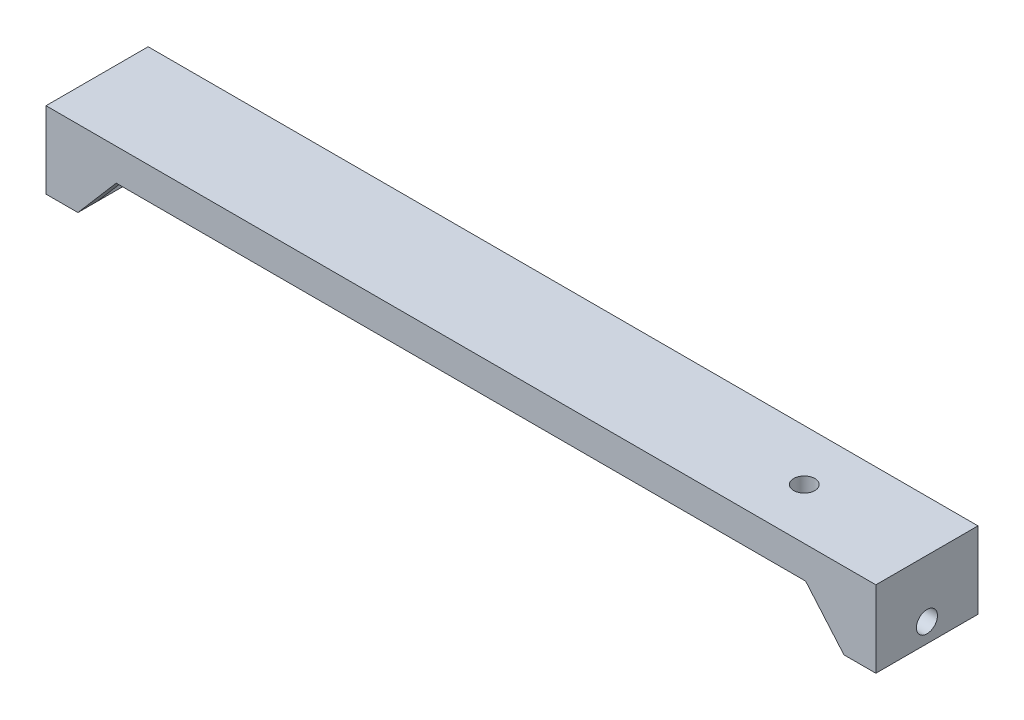
ISO-10303-21;
HEADER;
FILE_DESCRIPTION(('STEP AP214'),'2;1');
FILE_NAME('part.step','',(''),(''),'','','');
FILE_SCHEMA(('AUTOMOTIVE_DESIGN { 1 0 10303 214 1 1 1 1 }'));
ENDSEC;
DATA;
#1=APPLICATION_CONTEXT('core data for automotive mechanical design processes');
#2=APPLICATION_PROTOCOL_DEFINITION('international standard','automotive_design',2000,#1);
#3=PRODUCT_CONTEXT('',#1,'mechanical');
#4=PRODUCT('Part','Part','',(#3));
#5=PRODUCT_RELATED_PRODUCT_CATEGORY('part','',(#4));
#6=PRODUCT_DEFINITION_FORMATION('','',#4);
#7=PRODUCT_DEFINITION_CONTEXT('part definition',#1,'design');
#8=PRODUCT_DEFINITION('design','',#6,#7);
#9=PRODUCT_DEFINITION_SHAPE('','',#8);
#10=(LENGTH_UNIT() NAMED_UNIT(*) SI_UNIT(.MILLI.,.METRE.));
#11=(NAMED_UNIT(*) PLANE_ANGLE_UNIT() SI_UNIT($,.RADIAN.));
#12=(NAMED_UNIT(*) SI_UNIT($,.STERADIAN.) SOLID_ANGLE_UNIT());
#13=UNCERTAINTY_MEASURE_WITH_UNIT(LENGTH_MEASURE(1.E-05),#10,'distance_accuracy_value','');
#14=(GEOMETRIC_REPRESENTATION_CONTEXT(3) GLOBAL_UNCERTAINTY_ASSIGNED_CONTEXT((#13)) GLOBAL_UNIT_ASSIGNED_CONTEXT((#10,
#11,#12)) REPRESENTATION_CONTEXT('',''));
#15=CARTESIAN_POINT('',(0.,0.,0.));
#16=DIRECTION('',(0.,0.,1.));
#17=DIRECTION('',(1.,0.,0.));
#18=AXIS2_PLACEMENT_3D('',#15,#16,#17);
#19=CARTESIAN_POINT('',(60.,-5.00000000000001,16.));
#20=DIRECTION('',(0.,1.,0.));
#21=DIRECTION('',(0.,0.,1.));
#22=AXIS2_PLACEMENT_3D('',#19,#20,#21);
#23=PLANE('',#22);
#24=CARTESIAN_POINT('',(45.79,-5.00000000000001,8.));
#25=DIRECTION('',(0.,1.,0.));
#26=DIRECTION('',(0.,0.,1.));
#27=AXIS2_PLACEMENT_3D('',#24,#25,#26);
#28=CIRCLE('',#27,1.65);
#29=CARTESIAN_POINT('',(45.79,-5.00000000000001,9.65));
#30=VERTEX_POINT('',#29);
#31=EDGE_CURVE('E155',#30,#30,#28,.T.);
#32=ORIENTED_EDGE('',*,*,#31,.T.);
#33=EDGE_LOOP('',(#32));
#34=FACE_BOUND('',#33,.T.);
#35=DIRECTION('',(-1.,0.,0.));
#36=VECTOR('',#35,1.);
#37=CARTESIAN_POINT('',(54.,-5.00000000000001,13.));
#38=LINE('',#37,#36);
#39=CARTESIAN_POINT('',(60.,-5.00000000000001,13.));
#40=VERTEX_POINT('',#39);
#41=CARTESIAN_POINT('',(54.,-5.00000000000001,13.));
#42=VERTEX_POINT('',#41);
#43=EDGE_CURVE('E151',#40,#42,#38,.T.);
#44=ORIENTED_EDGE('',*,*,#43,.T.);
#45=DIRECTION('',(0.,0.,1.));
#46=VECTOR('',#45,1.);
#47=CARTESIAN_POINT('',(54.,-5.00000000000001,13.));
#48=LINE('',#47,#46);
#49=CARTESIAN_POINT('',(54.,-5.00000000000001,16.));
#50=VERTEX_POINT('',#49);
#51=EDGE_CURVE('E136',#42,#50,#48,.T.);
#52=ORIENTED_EDGE('',*,*,#51,.T.);
#53=DIRECTION('',(1.,0.,0.));
#54=VECTOR('',#53,1.);
#55=CARTESIAN_POINT('',(60.,-5.00000000000001,16.));
#56=LINE('',#55,#54);
#57=CARTESIAN_POINT('',(-54.,-5.00000000000001,16.));
#58=VERTEX_POINT('',#57);
#59=EDGE_CURVE('E224',#58,#50,#56,.T.);
#60=ORIENTED_EDGE('',*,*,#59,.F.);
#61=DIRECTION('',(0.,0.,1.));
#62=VECTOR('',#61,1.);
#63=CARTESIAN_POINT('',(-54.,-5.00000000000001,13.));
#64=LINE('',#63,#62);
#65=CARTESIAN_POINT('',(-54.,-5.00000000000001,13.));
#66=VERTEX_POINT('',#65);
#67=EDGE_CURVE('E184',#66,#58,#64,.T.);
#68=ORIENTED_EDGE('',*,*,#67,.F.);
#69=DIRECTION('',(1.,0.,0.));
#70=VECTOR('',#69,1.);
#71=CARTESIAN_POINT('',(-54.,-5.00000000000001,13.));
#72=LINE('',#71,#70);
#73=CARTESIAN_POINT('',(-60.,-5.00000000000001,13.));
#74=VERTEX_POINT('',#73);
#75=EDGE_CURVE('E177',#74,#66,#72,.T.);
#76=ORIENTED_EDGE('',*,*,#75,.F.);
#77=DIRECTION('',(0.,0.,-1.));
#78=VECTOR('',#77,1.);
#79=CARTESIAN_POINT('',(-60.,-5.00000000000001,16.));
#80=LINE('',#79,#78);
#81=CARTESIAN_POINT('',(-60.,-5.00000000000001,3.));
#82=VERTEX_POINT('',#81);
#83=EDGE_CURVE('E257',#74,#82,#80,.T.);
#84=ORIENTED_EDGE('',*,*,#83,.T.);
#85=DIRECTION('',(1.,0.,0.));
#86=VECTOR('',#85,1.);
#87=CARTESIAN_POINT('',(-54.,-5.00000000000001,3.));
#88=LINE('',#87,#86);
#89=CARTESIAN_POINT('',(-54.,-5.00000000000001,3.));
#90=VERTEX_POINT('',#89);
#91=EDGE_CURVE('E189',#82,#90,#88,.T.);
#92=ORIENTED_EDGE('',*,*,#91,.T.);
#93=DIRECTION('',(0.,0.,-1.));
#94=VECTOR('',#93,1.);
#95=CARTESIAN_POINT('',(-54.,-5.00000000000001,3.));
#96=LINE('',#95,#94);
#97=CARTESIAN_POINT('',(-54.,-5.,0.));
#98=VERTEX_POINT('',#97);
#99=EDGE_CURVE('E197',#90,#98,#96,.T.);
#100=ORIENTED_EDGE('',*,*,#99,.T.);
#101=DIRECTION('',(1.,0.,0.));
#102=VECTOR('',#101,1.);
#103=CARTESIAN_POINT('',(60.,-5.00000000000001,0.));
#104=LINE('',#103,#102);
#105=CARTESIAN_POINT('',(54.,-5.00000000000002,0.));
#106=VERTEX_POINT('',#105);
#107=EDGE_CURVE('E237',#98,#106,#104,.T.);
#108=ORIENTED_EDGE('',*,*,#107,.T.);
#109=DIRECTION('',(0.,0.,-1.));
#110=VECTOR('',#109,1.);
#111=CARTESIAN_POINT('',(54.,-5.00000000000001,3.));
#112=LINE('',#111,#110);
#113=CARTESIAN_POINT('',(54.,-5.00000000000001,3.));
#114=VERTEX_POINT('',#113);
#115=EDGE_CURVE('E49',#114,#106,#112,.T.);
#116=ORIENTED_EDGE('',*,*,#115,.F.);
#117=DIRECTION('',(-1.,0.,0.));
#118=VECTOR('',#117,1.);
#119=CARTESIAN_POINT('',(54.,-5.00000000000001,3.));
#120=LINE('',#119,#118);
#121=CARTESIAN_POINT('',(60.,-5.00000000000001,3.));
#122=VERTEX_POINT('',#121);
#123=EDGE_CURVE('E161',#122,#114,#120,.T.);
#124=ORIENTED_EDGE('',*,*,#123,.F.);
#125=DIRECTION('',(0.,0.,-1.));
#126=VECTOR('',#125,1.);
#127=CARTESIAN_POINT('',(60.,-5.00000000000001,16.));
#128=LINE('',#127,#126);
#129=EDGE_CURVE('E57',#40,#122,#128,.T.);
#130=ORIENTED_EDGE('',*,*,#129,.F.);
#131=EDGE_LOOP('',(#44,#52,#60,#68,#76,#84,#92,#100,#108,#116,#124,#130));
#132=FACE_BOUND('',#131,.T.);
#133=ADVANCED_FACE('F34',(#34,#132),#23,.F.);
#134=CARTESIAN_POINT('',(-65.,-12.,16.));
#135=DIRECTION('',(1.,0.,0.));
#136=DIRECTION('',(0.,0.,-1.));
#137=AXIS2_PLACEMENT_3D('',#134,#135,#136);
#138=PLANE('',#137);
#139=CARTESIAN_POINT('',(-65.,-8.99999999999993,8.));
#140=DIRECTION('',(1.,0.,0.));
#141=DIRECTION('',(0.,1.,0.));
#142=AXIS2_PLACEMENT_3D('',#139,#140,#141);
#143=CIRCLE('',#142,1.65);
#144=CARTESIAN_POINT('',(-65.,-7.34999999999993,8.));
#145=VERTEX_POINT('',#144);
#146=EDGE_CURVE('E207',#145,#145,#143,.T.);
#147=ORIENTED_EDGE('',*,*,#146,.T.);
#148=EDGE_LOOP('',(#147));
#149=FACE_BOUND('',#148,.T.);
#150=DIRECTION('',(0.,-1.,0.));
#151=VECTOR('',#150,1.);
#152=CARTESIAN_POINT('',(-65.,-12.,0.));
#153=LINE('',#152,#151);
#154=CARTESIAN_POINT('',(-65.,0.,0.));
#155=VERTEX_POINT('',#154);
#156=CARTESIAN_POINT('',(-65.,-12.,0.));
#157=VERTEX_POINT('',#156);
#158=EDGE_CURVE('E216',#155,#157,#153,.T.);
#159=ORIENTED_EDGE('',*,*,#158,.T.);
#160=DIRECTION('',(0.,0.,-1.));
#161=VECTOR('',#160,1.);
#162=CARTESIAN_POINT('',(-65.,-12.,16.));
#163=LINE('',#162,#161);
#164=CARTESIAN_POINT('',(-65.,-12.,16.));
#165=VERTEX_POINT('',#164);
#166=EDGE_CURVE('E11',#165,#157,#163,.T.);
#167=ORIENTED_EDGE('',*,*,#166,.F.);
#168=DIRECTION('',(0.,-1.,0.));
#169=VECTOR('',#168,1.);
#170=CARTESIAN_POINT('',(-65.,-12.,16.));
#171=LINE('',#170,#169);
#172=CARTESIAN_POINT('',(-65.,0.,16.));
#173=VERTEX_POINT('',#172);
#174=EDGE_CURVE('E217',#173,#165,#171,.T.);
#175=ORIENTED_EDGE('',*,*,#174,.F.);
#176=DIRECTION('',(0.,0.,-1.));
#177=VECTOR('',#176,1.);
#178=CARTESIAN_POINT('',(-65.,0.,16.));
#179=LINE('',#178,#177);
#180=EDGE_CURVE('E232',#173,#155,#179,.T.);
#181=ORIENTED_EDGE('',*,*,#180,.T.);
#182=EDGE_LOOP('',(#159,#167,#175,#181));
#183=FACE_BOUND('',#182,.T.);
#184=ADVANCED_FACE('F36',(#149,#183),#138,.F.);
#185=CARTESIAN_POINT('',(-60.,-12.,16.));
#186=DIRECTION('',(0.,1.,0.));
#187=DIRECTION('',(-1.,0.,0.));
#188=AXIS2_PLACEMENT_3D('',#185,#186,#187);
#189=PLANE('',#188);
#190=DIRECTION('',(1.,0.,0.));
#191=VECTOR('',#190,1.);
#192=CARTESIAN_POINT('',(-60.,-12.,0.));
#193=LINE('',#192,#191);
#194=CARTESIAN_POINT('',(-60.,-12.,0.));
#195=VERTEX_POINT('',#194);
#196=EDGE_CURVE('E235',#157,#195,#193,.T.);
#197=ORIENTED_EDGE('',*,*,#196,.T.);
#198=DIRECTION('',(0.,0.,-1.));
#199=VECTOR('',#198,1.);
#200=CARTESIAN_POINT('',(-60.,-12.,3.));
#201=LINE('',#200,#199);
#202=CARTESIAN_POINT('',(-60.,-12.,3.));
#203=VERTEX_POINT('',#202);
#204=EDGE_CURVE('E200',#203,#195,#201,.T.);
#205=ORIENTED_EDGE('',*,*,#204,.F.);
#206=DIRECTION('',(0.,0.,-1.));
#207=VECTOR('',#206,1.);
#208=CARTESIAN_POINT('',(-60.,-12.,16.));
#209=LINE('',#208,#207);
#210=CARTESIAN_POINT('',(-60.,-12.,13.));
#211=VERTEX_POINT('',#210);
#212=EDGE_CURVE('E258',#211,#203,#209,.T.);
#213=ORIENTED_EDGE('',*,*,#212,.F.);
#214=CARTESIAN_POINT('',(-60.,-12.,16.));
#215=VERTEX_POINT('',#214);
#216=EDGE_CURVE('E42',#215,#211,#209,.T.);
#217=ORIENTED_EDGE('',*,*,#216,.F.);
#218=DIRECTION('',(1.,0.,0.));
#219=VECTOR('',#218,1.);
#220=CARTESIAN_POINT('',(-60.,-12.,16.));
#221=LINE('',#220,#219);
#222=EDGE_CURVE('E220',#165,#215,#221,.T.);
#223=ORIENTED_EDGE('',*,*,#222,.F.);
#224=ORIENTED_EDGE('',*,*,#166,.T.);
#225=EDGE_LOOP('',(#197,#205,#213,#217,#223,#224));
#226=FACE_BOUND('',#225,.T.);
#227=ADVANCED_FACE('F271',(#226),#189,.F.);
#228=CARTESIAN_POINT('',(-60.,-5.00000000000001,16.));
#229=DIRECTION('',(-1.,0.,0.));
#230=DIRECTION('',(0.,-1.,0.));
#231=AXIS2_PLACEMENT_3D('',#228,#229,#230);
#232=PLANE('',#231);
#233=CARTESIAN_POINT('',(-60.,-8.99999999999994,8.));
#234=DIRECTION('',(-1.,0.,0.));
#235=DIRECTION('',(0.,-1.,0.));
#236=AXIS2_PLACEMENT_3D('',#233,#234,#235);
#237=CIRCLE('',#236,1.65);
#238=CARTESIAN_POINT('',(-60.,-10.6499999999999,8.));
#239=VERTEX_POINT('',#238);
#240=EDGE_CURVE('E213',#239,#239,#237,.T.);
#241=ORIENTED_EDGE('',*,*,#240,.T.);
#242=EDGE_LOOP('',(#241));
#243=FACE_BOUND('',#242,.T.);
#244=ORIENTED_EDGE('',*,*,#83,.F.);
#245=DIRECTION('',(0.,1.,0.));
#246=VECTOR('',#245,1.);
#247=CARTESIAN_POINT('',(-60.,-5.00000000000001,13.));
#248=LINE('',#247,#246);
#249=EDGE_CURVE('E180',#211,#74,#248,.T.);
#250=ORIENTED_EDGE('',*,*,#249,.F.);
#251=ORIENTED_EDGE('',*,*,#212,.T.);
#252=DIRECTION('',(0.,1.,0.));
#253=VECTOR('',#252,1.);
#254=CARTESIAN_POINT('',(-60.,-5.00000000000001,3.));
#255=LINE('',#254,#253);
#256=EDGE_CURVE('E194',#203,#82,#255,.T.);
#257=ORIENTED_EDGE('',*,*,#256,.T.);
#258=EDGE_LOOP('',(#244,#250,#251,#257));
#259=FACE_BOUND('',#258,.T.);
#260=ADVANCED_FACE('F267',(#243,#259),#232,.F.);
#261=CARTESIAN_POINT('',(60.,-12.,16.));
#262=DIRECTION('',(1.,0.,0.));
#263=DIRECTION('',(0.,1.,0.));
#264=AXIS2_PLACEMENT_3D('',#261,#262,#263);
#265=PLANE('',#264);
#266=CARTESIAN_POINT('',(60.,-9.00000000000001,8.));
#267=DIRECTION('',(1.,0.,0.));
#268=DIRECTION('',(0.,1.,0.));
#269=AXIS2_PLACEMENT_3D('',#266,#267,#268);
#270=CIRCLE('',#269,1.65);
#271=CARTESIAN_POINT('',(60.,-7.35000000000001,8.));
#272=VERTEX_POINT('',#271);
#273=EDGE_CURVE('E210',#272,#272,#270,.T.);
#274=ORIENTED_EDGE('',*,*,#273,.T.);
#275=EDGE_LOOP('',(#274));
#276=FACE_BOUND('',#275,.T.);
#277=DIRECTION('',(0.,0.,-1.));
#278=VECTOR('',#277,1.);
#279=CARTESIAN_POINT('',(60.,-12.,16.));
#280=LINE('',#279,#278);
#281=CARTESIAN_POINT('',(60.,-12.,13.));
#282=VERTEX_POINT('',#281);
#283=CARTESIAN_POINT('',(60.,-12.,3.));
#284=VERTEX_POINT('',#283);
#285=EDGE_CURVE('E252',#282,#284,#280,.T.);
#286=ORIENTED_EDGE('',*,*,#285,.F.);
#287=DIRECTION('',(0.,1.,0.));
#288=VECTOR('',#287,1.);
#289=CARTESIAN_POINT('',(60.,-5.00000000000001,13.));
#290=LINE('',#289,#288);
#291=EDGE_CURVE('E147',#282,#40,#290,.T.);
#292=ORIENTED_EDGE('',*,*,#291,.T.);
#293=ORIENTED_EDGE('',*,*,#129,.T.);
#294=DIRECTION('',(0.,1.,0.));
#295=VECTOR('',#294,1.);
#296=CARTESIAN_POINT('',(60.,-5.00000000000001,3.));
#297=LINE('',#296,#295);
#298=EDGE_CURVE('E164',#284,#122,#297,.T.);
#299=ORIENTED_EDGE('',*,*,#298,.F.);
#300=EDGE_LOOP('',(#286,#292,#293,#299));
#301=FACE_BOUND('',#300,.T.);
#302=ADVANCED_FACE('F302',(#276,#301),#265,.F.);
#303=CARTESIAN_POINT('',(65.,-12.,16.));
#304=DIRECTION('',(0.,1.,0.));
#305=DIRECTION('',(-1.,0.,0.));
#306=AXIS2_PLACEMENT_3D('',#303,#304,#305);
#307=PLANE('',#306);
#308=DIRECTION('',(1.,0.,0.));
#309=VECTOR('',#308,1.);
#310=CARTESIAN_POINT('',(65.,-12.,0.));
#311=LINE('',#310,#309);
#312=CARTESIAN_POINT('',(60.,-12.,0.));
#313=VERTEX_POINT('',#312);
#314=CARTESIAN_POINT('',(65.,-12.,0.));
#315=VERTEX_POINT('',#314);
#316=EDGE_CURVE('E239',#313,#315,#311,.T.);
#317=ORIENTED_EDGE('',*,*,#316,.T.);
#318=DIRECTION('',(0.,0.,-1.));
#319=VECTOR('',#318,1.);
#320=CARTESIAN_POINT('',(65.,-12.,16.));
#321=LINE('',#320,#319);
#322=CARTESIAN_POINT('',(65.,-12.,16.));
#323=VERTEX_POINT('',#322);
#324=EDGE_CURVE('E249',#323,#315,#321,.T.);
#325=ORIENTED_EDGE('',*,*,#324,.F.);
#326=DIRECTION('',(1.,0.,0.));
#327=VECTOR('',#326,1.);
#328=CARTESIAN_POINT('',(65.,-12.,16.));
#329=LINE('',#328,#327);
#330=CARTESIAN_POINT('',(60.,-12.,16.));
#331=VERTEX_POINT('',#330);
#332=EDGE_CURVE('E226',#331,#323,#329,.T.);
#333=ORIENTED_EDGE('',*,*,#332,.F.);
#334=EDGE_CURVE('E253',#331,#282,#280,.T.);
#335=ORIENTED_EDGE('',*,*,#334,.T.);
#336=ORIENTED_EDGE('',*,*,#285,.T.);
#337=DIRECTION('',(0.,0.,-1.));
#338=VECTOR('',#337,1.);
#339=CARTESIAN_POINT('',(60.,-12.,3.));
#340=LINE('',#339,#338);
#341=EDGE_CURVE('E170',#284,#313,#340,.T.);
#342=ORIENTED_EDGE('',*,*,#341,.T.);
#343=EDGE_LOOP('',(#317,#325,#333,#335,#336,#342));
#344=FACE_BOUND('',#343,.T.);
#345=ADVANCED_FACE('F305',(#344),#307,.F.);
#346=CARTESIAN_POINT('',(65.,0.,16.));
#347=DIRECTION('',(-1.,0.,0.));
#348=DIRECTION('',(0.,0.,1.));
#349=AXIS2_PLACEMENT_3D('',#346,#347,#348);
#350=PLANE('',#349);
#351=CARTESIAN_POINT('',(65.,-9.00000000000001,8.));
#352=DIRECTION('',(1.,0.,0.));
#353=DIRECTION('',(0.,1.,0.));
#354=AXIS2_PLACEMENT_3D('',#351,#352,#353);
#355=CIRCLE('',#354,1.65);
#356=CARTESIAN_POINT('',(65.,-7.35000000000001,8.));
#357=VERTEX_POINT('',#356);
#358=EDGE_CURVE('E203',#357,#357,#355,.T.);
#359=ORIENTED_EDGE('',*,*,#358,.F.);
#360=EDGE_LOOP('',(#359));
#361=FACE_BOUND('',#360,.T.);
#362=DIRECTION('',(0.,1.,0.));
#363=VECTOR('',#362,1.);
#364=CARTESIAN_POINT('',(65.,0.,0.));
#365=LINE('',#364,#363);
#366=CARTESIAN_POINT('',(65.,0.,0.));
#367=VERTEX_POINT('',#366);
#368=EDGE_CURVE('E241',#315,#367,#365,.T.);
#369=ORIENTED_EDGE('',*,*,#368,.T.);
#370=DIRECTION('',(0.,0.,-1.));
#371=VECTOR('',#370,1.);
#372=CARTESIAN_POINT('',(65.,0.,16.));
#373=LINE('',#372,#371);
#374=CARTESIAN_POINT('',(65.,0.,16.));
#375=VERTEX_POINT('',#374);
#376=EDGE_CURVE('E246',#375,#367,#373,.T.);
#377=ORIENTED_EDGE('',*,*,#376,.F.);
#378=DIRECTION('',(0.,1.,0.));
#379=VECTOR('',#378,1.);
#380=CARTESIAN_POINT('',(65.,0.,16.));
#381=LINE('',#380,#379);
#382=EDGE_CURVE('E228',#323,#375,#381,.T.);
#383=ORIENTED_EDGE('',*,*,#382,.F.);
#384=ORIENTED_EDGE('',*,*,#324,.T.);
#385=EDGE_LOOP('',(#369,#377,#383,#384));
#386=FACE_BOUND('',#385,.T.);
#387=ADVANCED_FACE('F311',(#361,#386),#350,.F.);
#388=CARTESIAN_POINT('',(-65.,0.,16.));
#389=DIRECTION('',(0.,-1.,0.));
#390=DIRECTION('',(0.,0.,-1.));
#391=AXIS2_PLACEMENT_3D('',#388,#389,#390);
#392=PLANE('',#391);
#393=CARTESIAN_POINT('',(45.79,0.,8.));
#394=DIRECTION('',(0.,1.,0.));
#395=DIRECTION('',(0.,0.,1.));
#396=AXIS2_PLACEMENT_3D('',#393,#394,#395);
#397=CIRCLE('',#396,1.65);
#398=CARTESIAN_POINT('',(45.79,0.,9.65));
#399=VERTEX_POINT('',#398);
#400=EDGE_CURVE('E497',#399,#399,#397,.T.);
#401=ORIENTED_EDGE('',*,*,#400,.F.);
#402=EDGE_LOOP('',(#401));
#403=FACE_BOUND('',#402,.T.);
#404=DIRECTION('',(-1.,0.,0.));
#405=VECTOR('',#404,1.);
#406=CARTESIAN_POINT('',(-65.,0.,0.));
#407=LINE('',#406,#405);
#408=EDGE_CURVE('E221',#367,#155,#407,.T.);
#409=ORIENTED_EDGE('',*,*,#408,.T.);
#410=ORIENTED_EDGE('',*,*,#180,.F.);
#411=DIRECTION('',(-1.,0.,0.));
#412=VECTOR('',#411,1.);
#413=CARTESIAN_POINT('',(-65.,0.,16.));
#414=LINE('',#413,#412);
#415=EDGE_CURVE('E230',#375,#173,#414,.T.);
#416=ORIENTED_EDGE('',*,*,#415,.F.);
#417=ORIENTED_EDGE('',*,*,#376,.T.);
#418=EDGE_LOOP('',(#409,#410,#416,#417));
#419=FACE_BOUND('',#418,.T.);
#420=ADVANCED_FACE('F313',(#403,#419),#392,.F.);
#421=CARTESIAN_POINT('',(0.,0.,16.));
#422=DIRECTION('',(0.,0.,-1.));
#423=DIRECTION('',(-1.,0.,0.));
#424=AXIS2_PLACEMENT_3D('',#421,#422,#423);
#425=PLANE('',#424);
#426=ORIENTED_EDGE('',*,*,#59,.T.);
#427=DIRECTION('',(0.65079137345597,-0.759256602365296,0.));
#428=VECTOR('',#427,1.);
#429=CARTESIAN_POINT('',(54.,-5.00000000000001,16.));
#430=LINE('',#429,#428);
#431=EDGE_CURVE('E142',#50,#331,#430,.T.);
#432=ORIENTED_EDGE('',*,*,#431,.T.);
#433=ORIENTED_EDGE('',*,*,#332,.T.);
#434=ORIENTED_EDGE('',*,*,#382,.T.);
#435=ORIENTED_EDGE('',*,*,#415,.T.);
#436=ORIENTED_EDGE('',*,*,#174,.T.);
#437=ORIENTED_EDGE('',*,*,#222,.T.);
#438=DIRECTION('',(-0.65079137345597,-0.759256602365296,0.));
#439=VECTOR('',#438,1.);
#440=CARTESIAN_POINT('',(-54.,-5.00000000000001,16.));
#441=LINE('',#440,#439);
#442=EDGE_CURVE('E174',#58,#215,#441,.T.);
#443=ORIENTED_EDGE('',*,*,#442,.F.);
#444=EDGE_LOOP('',(#426,#432,#433,#434,#435,#436,#437,#443));
#445=FACE_BOUND('',#444,.T.);
#446=ADVANCED_FACE('F286',(#445),#425,.F.);
#447=CARTESIAN_POINT('',(0.,0.,0.));
#448=DIRECTION('',(0.,0.,-1.));
#449=DIRECTION('',(-1.,0.,0.));
#450=AXIS2_PLACEMENT_3D('',#447,#448,#449);
#451=PLANE('',#450);
#452=DIRECTION('',(0.65079137345597,-0.759256602365296,0.));
#453=VECTOR('',#452,1.);
#454=CARTESIAN_POINT('',(54.,-5.00000000000001,0.));
#455=LINE('',#454,#453);
#456=EDGE_CURVE('E146',#106,#313,#455,.T.);
#457=ORIENTED_EDGE('',*,*,#456,.F.);
#458=ORIENTED_EDGE('',*,*,#107,.F.);
#459=DIRECTION('',(-0.65079137345597,-0.759256602365296,0.));
#460=VECTOR('',#459,1.);
#461=CARTESIAN_POINT('',(-54.,-5.00000000000001,0.));
#462=LINE('',#461,#460);
#463=EDGE_CURVE('E188',#98,#195,#462,.T.);
#464=ORIENTED_EDGE('',*,*,#463,.T.);
#465=ORIENTED_EDGE('',*,*,#196,.F.);
#466=ORIENTED_EDGE('',*,*,#158,.F.);
#467=ORIENTED_EDGE('',*,*,#408,.F.);
#468=ORIENTED_EDGE('',*,*,#368,.F.);
#469=ORIENTED_EDGE('',*,*,#316,.F.);
#470=EDGE_LOOP('',(#457,#458,#464,#465,#466,#467,#468,#469));
#471=FACE_BOUND('',#470,.T.);
#472=ADVANCED_FACE('F295',(#471),#451,.T.);
#473=CARTESIAN_POINT('',(-65.,-8.99999999999993,8.));
#474=DIRECTION('',(1.,0.,0.));
#475=DIRECTION('',(0.,1.,0.));
#476=AXIS2_PLACEMENT_3D('',#473,#474,#475);
#477=CYLINDRICAL_SURFACE('',#476,1.65);
#478=ORIENTED_EDGE('',*,*,#358,.T.);
#479=EDGE_LOOP('',(#478));
#480=FACE_BOUND('',#479,.T.);
#481=ORIENTED_EDGE('',*,*,#273,.F.);
#482=EDGE_LOOP('',(#481));
#483=FACE_BOUND('',#482,.T.);
#484=ADVANCED_FACE('F375',(#480,#483),#477,.F.);
#485=ORIENTED_EDGE('',*,*,#146,.F.);
#486=EDGE_LOOP('',(#485));
#487=FACE_BOUND('',#486,.T.);
#488=ORIENTED_EDGE('',*,*,#240,.F.);
#489=EDGE_LOOP('',(#488));
#490=FACE_BOUND('',#489,.T.);
#491=ADVANCED_FACE('F380',(#487,#490),#477,.F.);
#492=CARTESIAN_POINT('',(-54.,-5.00000000000001,3.));
#493=DIRECTION('',(0.759256602365296,-0.650791373455969,0.));
#494=DIRECTION('',(0.65079137345597,0.759256602365296,0.));
#495=AXIS2_PLACEMENT_3D('',#492,#493,#494);
#496=PLANE('',#495);
#497=ORIENTED_EDGE('',*,*,#463,.F.);
#498=ORIENTED_EDGE('',*,*,#99,.F.);
#499=DIRECTION('',(-0.65079137345597,-0.759256602365296,0.));
#500=VECTOR('',#499,1.);
#501=CARTESIAN_POINT('',(-54.,-5.00000000000001,3.));
#502=LINE('',#501,#500);
#503=EDGE_CURVE('E191',#90,#203,#502,.T.);
#504=ORIENTED_EDGE('',*,*,#503,.T.);
#505=ORIENTED_EDGE('',*,*,#204,.T.);
#506=EDGE_LOOP('',(#497,#498,#504,#505));
#507=FACE_BOUND('',#506,.T.);
#508=ADVANCED_FACE('F276',(#507),#496,.T.);
#509=CARTESIAN_POINT('',(0.,0.,3.));
#510=DIRECTION('',(0.,0.,1.));
#511=DIRECTION('',(1.,0.,0.));
#512=AXIS2_PLACEMENT_3D('',#509,#510,#511);
#513=PLANE('',#512);
#514=ORIENTED_EDGE('',*,*,#91,.F.);
#515=ORIENTED_EDGE('',*,*,#256,.F.);
#516=ORIENTED_EDGE('',*,*,#503,.F.);
#517=EDGE_LOOP('',(#514,#515,#516));
#518=FACE_BOUND('',#517,.T.);
#519=ADVANCED_FACE('F278',(#518),#513,.T.);
#520=CARTESIAN_POINT('',(-54.,-5.00000000000001,13.));
#521=DIRECTION('',(-0.759256602365296,0.650791373455969,0.));
#522=DIRECTION('',(-0.65079137345597,-0.759256602365296,0.));
#523=AXIS2_PLACEMENT_3D('',#520,#521,#522);
#524=PLANE('',#523);
#525=ORIENTED_EDGE('',*,*,#442,.T.);
#526=ORIENTED_EDGE('',*,*,#216,.T.);
#527=DIRECTION('',(-0.65079137345597,-0.759256602365296,0.));
#528=VECTOR('',#527,1.);
#529=CARTESIAN_POINT('',(-54.,-5.00000000000001,13.));
#530=LINE('',#529,#528);
#531=EDGE_CURVE('E182',#66,#211,#530,.T.);
#532=ORIENTED_EDGE('',*,*,#531,.F.);
#533=ORIENTED_EDGE('',*,*,#67,.T.);
#534=EDGE_LOOP('',(#525,#526,#532,#533));
#535=FACE_BOUND('',#534,.T.);
#536=ADVANCED_FACE('F284',(#535),#524,.F.);
#537=CARTESIAN_POINT('',(0.,0.,13.));
#538=DIRECTION('',(0.,0.,-1.));
#539=DIRECTION('',(1.,0.,0.));
#540=AXIS2_PLACEMENT_3D('',#537,#538,#539);
#541=PLANE('',#540);
#542=ORIENTED_EDGE('',*,*,#75,.T.);
#543=ORIENTED_EDGE('',*,*,#531,.T.);
#544=ORIENTED_EDGE('',*,*,#249,.T.);
#545=EDGE_LOOP('',(#542,#543,#544));
#546=FACE_BOUND('',#545,.T.);
#547=ADVANCED_FACE('F283',(#546),#541,.T.);
#548=CARTESIAN_POINT('',(54.,-5.00000000000001,3.));
#549=DIRECTION('',(0.759256602365296,0.650791373455969,0.));
#550=DIRECTION('',(-0.65079137345597,0.759256602365296,0.));
#551=AXIS2_PLACEMENT_3D('',#548,#549,#550);
#552=PLANE('',#551);
#553=ORIENTED_EDGE('',*,*,#456,.T.);
#554=ORIENTED_EDGE('',*,*,#341,.F.);
#555=DIRECTION('',(0.65079137345597,-0.759256602365296,0.));
#556=VECTOR('',#555,1.);
#557=CARTESIAN_POINT('',(54.,-5.00000000000001,3.));
#558=LINE('',#557,#556);
#559=EDGE_CURVE('E167',#114,#284,#558,.T.);
#560=ORIENTED_EDGE('',*,*,#559,.F.);
#561=ORIENTED_EDGE('',*,*,#115,.T.);
#562=EDGE_LOOP('',(#553,#554,#560,#561));
#563=FACE_BOUND('',#562,.T.);
#564=ADVANCED_FACE('F299',(#563),#552,.F.);
#565=CARTESIAN_POINT('',(0.,0.,3.));
#566=DIRECTION('',(0.,0.,1.));
#567=DIRECTION('',(-1.,0.,0.));
#568=AXIS2_PLACEMENT_3D('',#565,#566,#567);
#569=PLANE('',#568);
#570=ORIENTED_EDGE('',*,*,#123,.T.);
#571=ORIENTED_EDGE('',*,*,#559,.T.);
#572=ORIENTED_EDGE('',*,*,#298,.T.);
#573=EDGE_LOOP('',(#570,#571,#572));
#574=FACE_BOUND('',#573,.T.);
#575=ADVANCED_FACE('F301',(#574),#569,.T.);
#576=CARTESIAN_POINT('',(54.,-5.00000000000001,13.));
#577=DIRECTION('',(-0.759256602365296,-0.650791373455969,0.));
#578=DIRECTION('',(0.65079137345597,-0.759256602365296,0.));
#579=AXIS2_PLACEMENT_3D('',#576,#577,#578);
#580=PLANE('',#579);
#581=ORIENTED_EDGE('',*,*,#431,.F.);
#582=ORIENTED_EDGE('',*,*,#51,.F.);
#583=DIRECTION('',(0.65079137345597,-0.759256602365296,0.));
#584=VECTOR('',#583,1.);
#585=CARTESIAN_POINT('',(54.,-5.00000000000001,13.));
#586=LINE('',#585,#584);
#587=EDGE_CURVE('E140',#42,#282,#586,.T.);
#588=ORIENTED_EDGE('',*,*,#587,.T.);
#589=ORIENTED_EDGE('',*,*,#334,.F.);
#590=EDGE_LOOP('',(#581,#582,#588,#589));
#591=FACE_BOUND('',#590,.T.);
#592=ADVANCED_FACE('F138',(#591),#580,.T.);
#593=CARTESIAN_POINT('',(0.,0.,13.));
#594=DIRECTION('',(0.,0.,-1.));
#595=DIRECTION('',(-1.,0.,0.));
#596=AXIS2_PLACEMENT_3D('',#593,#594,#595);
#597=PLANE('',#596);
#598=ORIENTED_EDGE('',*,*,#43,.F.);
#599=ORIENTED_EDGE('',*,*,#291,.F.);
#600=ORIENTED_EDGE('',*,*,#587,.F.);
#601=EDGE_LOOP('',(#598,#599,#600));
#602=FACE_BOUND('',#601,.T.);
#603=ADVANCED_FACE('F150',(#602),#597,.T.);
#604=CARTESIAN_POINT('',(45.79,-10.,8.));
#605=DIRECTION('',(0.,1.,0.));
#606=DIRECTION('',(0.,0.,1.));
#607=AXIS2_PLACEMENT_3D('',#604,#605,#606);
#608=CYLINDRICAL_SURFACE('',#607,1.65);
#609=ORIENTED_EDGE('',*,*,#400,.T.);
#610=EDGE_LOOP('',(#609));
#611=FACE_BOUND('',#610,.T.);
#612=ORIENTED_EDGE('',*,*,#31,.F.);
#613=EDGE_LOOP('',(#612));
#614=FACE_BOUND('',#613,.T.);
#615=ADVANCED_FACE('F445',(#611,#614),#608,.F.);
#616=CLOSED_SHELL('',(#133,#184,#227,#260,#302,#345,#387,#420,#446,#472,#484,#491,#508,#519,
#536,#547,#564,#575,#592,#603,#615));
#617=MANIFOLD_SOLID_BREP('B2',#616);
#618=ADVANCED_BREP_SHAPE_REPRESENTATION('',(#18,#617),#14);
#619=SHAPE_DEFINITION_REPRESENTATION(#9,#618);
ENDSEC;
END-ISO-10303-21;
